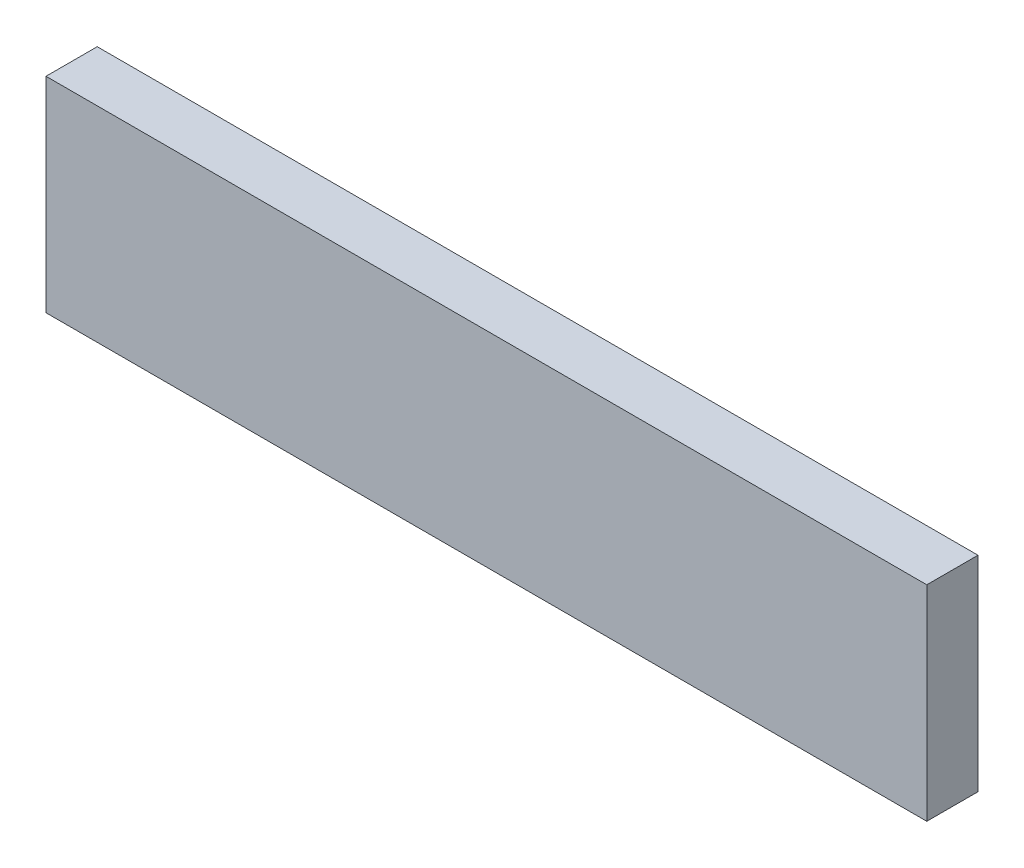
ISO-10303-21;
HEADER;
FILE_DESCRIPTION(('STEP AP214'),'2;1');
FILE_NAME('part.step','',(''),(''),'','','');
FILE_SCHEMA(('AUTOMOTIVE_DESIGN { 1 0 10303 214 1 1 1 1 }'));
ENDSEC;
DATA;
#1=APPLICATION_CONTEXT('core data for automotive mechanical design processes');
#2=APPLICATION_PROTOCOL_DEFINITION('international standard','automotive_design',2000,#1);
#3=PRODUCT_CONTEXT('',#1,'mechanical');
#4=PRODUCT('Part','Part','',(#3));
#5=PRODUCT_RELATED_PRODUCT_CATEGORY('part','',(#4));
#6=PRODUCT_DEFINITION_FORMATION('','',#4);
#7=PRODUCT_DEFINITION_CONTEXT('part definition',#1,'design');
#8=PRODUCT_DEFINITION('design','',#6,#7);
#9=PRODUCT_DEFINITION_SHAPE('','',#8);
#10=(LENGTH_UNIT() NAMED_UNIT(*) SI_UNIT(.MILLI.,.METRE.));
#11=(NAMED_UNIT(*) PLANE_ANGLE_UNIT() SI_UNIT($,.RADIAN.));
#12=(NAMED_UNIT(*) SI_UNIT($,.STERADIAN.) SOLID_ANGLE_UNIT());
#13=UNCERTAINTY_MEASURE_WITH_UNIT(LENGTH_MEASURE(1.E-05),#10,'distance_accuracy_value','');
#14=(GEOMETRIC_REPRESENTATION_CONTEXT(3) GLOBAL_UNCERTAINTY_ASSIGNED_CONTEXT((#13)) GLOBAL_UNIT_ASSIGNED_CONTEXT((#10,
#11,#12)) REPRESENTATION_CONTEXT('',''));
#15=CARTESIAN_POINT('',(0.,0.,0.));
#16=DIRECTION('',(0.,0.,1.));
#17=DIRECTION('',(1.,0.,0.));
#18=AXIS2_PLACEMENT_3D('',#15,#16,#17);
#19=CARTESIAN_POINT('',(-50.6256146951868,20.,5.));
#20=DIRECTION('',(1.,0.,0.));
#21=DIRECTION('',(0.,0.,-1.));
#22=AXIS2_PLACEMENT_3D('',#19,#20,#21);
#23=PLANE('',#22);
#24=DIRECTION('',(0.,-1.,0.));
#25=VECTOR('',#24,1.);
#26=CARTESIAN_POINT('',(-50.6256146951868,20.,0.));
#27=LINE('',#26,#25);
#28=CARTESIAN_POINT('',(-50.6256146951868,20.,0.));
#29=VERTEX_POINT('',#28);
#30=CARTESIAN_POINT('',(-50.6256146951868,0.,0.));
#31=VERTEX_POINT('',#30);
#32=EDGE_CURVE('E96',#29,#31,#27,.T.);
#33=ORIENTED_EDGE('',*,*,#32,.T.);
#34=DIRECTION('',(0.,0.,-1.));
#35=VECTOR('',#34,1.);
#36=CARTESIAN_POINT('',(-50.6256146951868,0.,5.));
#37=LINE('',#36,#35);
#38=CARTESIAN_POINT('',(-50.6256146951868,0.,5.));
#39=VERTEX_POINT('',#38);
#40=EDGE_CURVE('E11',#39,#31,#37,.T.);
#41=ORIENTED_EDGE('',*,*,#40,.F.);
#42=DIRECTION('',(0.,-1.,0.));
#43=VECTOR('',#42,1.);
#44=CARTESIAN_POINT('',(-50.6256146951868,20.,5.));
#45=LINE('',#44,#43);
#46=CARTESIAN_POINT('',(-50.6256146951868,20.,5.));
#47=VERTEX_POINT('',#46);
#48=EDGE_CURVE('E84',#47,#39,#45,.T.);
#49=ORIENTED_EDGE('',*,*,#48,.F.);
#50=DIRECTION('',(0.,0.,-1.));
#51=VECTOR('',#50,1.);
#52=CARTESIAN_POINT('',(-50.6256146951868,20.,5.));
#53=LINE('',#52,#51);
#54=EDGE_CURVE('E92',#47,#29,#53,.T.);
#55=ORIENTED_EDGE('',*,*,#54,.T.);
#56=EDGE_LOOP('',(#33,#41,#49,#55));
#57=FACE_BOUND('',#56,.T.);
#58=ADVANCED_FACE('F33',(#57),#23,.F.);
#59=CARTESIAN_POINT('',(-50.6256146951868,0.,5.));
#60=DIRECTION('',(0.,1.,0.));
#61=DIRECTION('',(0.,0.,1.));
#62=AXIS2_PLACEMENT_3D('',#59,#60,#61);
#63=PLANE('',#62);
#64=DIRECTION('',(1.,0.,0.));
#65=VECTOR('',#64,1.);
#66=CARTESIAN_POINT('',(-50.6256146951868,0.,0.));
#67=LINE('',#66,#65);
#68=CARTESIAN_POINT('',(35.3743853048131,0.,0.));
#69=VERTEX_POINT('',#68);
#70=EDGE_CURVE('E88',#31,#69,#67,.T.);
#71=ORIENTED_EDGE('',*,*,#70,.T.);
#72=DIRECTION('',(0.,0.,-1.));
#73=VECTOR('',#72,1.);
#74=CARTESIAN_POINT('',(35.3743853048131,0.,5.));
#75=LINE('',#74,#73);
#76=CARTESIAN_POINT('',(35.3743853048131,0.,5.));
#77=VERTEX_POINT('',#76);
#78=EDGE_CURVE('E41',#77,#69,#75,.T.);
#79=ORIENTED_EDGE('',*,*,#78,.F.);
#80=DIRECTION('',(1.,0.,0.));
#81=VECTOR('',#80,1.);
#82=CARTESIAN_POINT('',(-50.6256146951868,0.,5.));
#83=LINE('',#82,#81);
#84=EDGE_CURVE('E79',#39,#77,#83,.T.);
#85=ORIENTED_EDGE('',*,*,#84,.F.);
#86=ORIENTED_EDGE('',*,*,#40,.T.);
#87=EDGE_LOOP('',(#71,#79,#85,#86));
#88=FACE_BOUND('',#87,.T.);
#89=ADVANCED_FACE('F87',(#88),#63,.F.);
#90=CARTESIAN_POINT('',(35.3743853048131,20.,5.));
#91=DIRECTION('',(-1.,0.,0.));
#92=DIRECTION('',(0.,0.,1.));
#93=AXIS2_PLACEMENT_3D('',#90,#91,#92);
#94=PLANE('',#93);
#95=DIRECTION('',(0.,1.,0.));
#96=VECTOR('',#95,1.);
#97=CARTESIAN_POINT('',(35.3743853048131,20.,0.));
#98=LINE('',#97,#96);
#99=CARTESIAN_POINT('',(35.3743853048131,20.,0.));
#100=VERTEX_POINT('',#99);
#101=EDGE_CURVE('E66',#69,#100,#98,.T.);
#102=ORIENTED_EDGE('',*,*,#101,.T.);
#103=DIRECTION('',(0.,0.,-1.));
#104=VECTOR('',#103,1.);
#105=CARTESIAN_POINT('',(35.3743853048131,20.,5.));
#106=LINE('',#105,#104);
#107=CARTESIAN_POINT('',(35.3743853048131,20.,5.));
#108=VERTEX_POINT('',#107);
#109=EDGE_CURVE('E89',#108,#100,#106,.T.);
#110=ORIENTED_EDGE('',*,*,#109,.F.);
#111=DIRECTION('',(0.,1.,0.));
#112=VECTOR('',#111,1.);
#113=CARTESIAN_POINT('',(35.3743853048131,20.,5.));
#114=LINE('',#113,#112);
#115=EDGE_CURVE('E82',#77,#108,#114,.T.);
#116=ORIENTED_EDGE('',*,*,#115,.F.);
#117=ORIENTED_EDGE('',*,*,#78,.T.);
#118=EDGE_LOOP('',(#102,#110,#116,#117));
#119=FACE_BOUND('',#118,.T.);
#120=ADVANCED_FACE('F90',(#119),#94,.F.);
#121=CARTESIAN_POINT('',(-50.6256146951868,20.,5.));
#122=DIRECTION('',(0.,-1.,0.));
#123=DIRECTION('',(0.,0.,-1.));
#124=AXIS2_PLACEMENT_3D('',#121,#122,#123);
#125=PLANE('',#124);
#126=DIRECTION('',(-1.,0.,0.));
#127=VECTOR('',#126,1.);
#128=CARTESIAN_POINT('',(-50.6256146951868,20.,0.));
#129=LINE('',#128,#127);
#130=EDGE_CURVE('E72',#100,#29,#129,.T.);
#131=ORIENTED_EDGE('',*,*,#130,.T.);
#132=ORIENTED_EDGE('',*,*,#54,.F.);
#133=DIRECTION('',(-1.,0.,0.));
#134=VECTOR('',#133,1.);
#135=CARTESIAN_POINT('',(-50.6256146951868,20.,5.));
#136=LINE('',#135,#134);
#137=EDGE_CURVE('E49',#108,#47,#136,.T.);
#138=ORIENTED_EDGE('',*,*,#137,.F.);
#139=ORIENTED_EDGE('',*,*,#109,.T.);
#140=EDGE_LOOP('',(#131,#132,#138,#139));
#141=FACE_BOUND('',#140,.T.);
#142=ADVANCED_FACE('F103',(#141),#125,.F.);
#143=CARTESIAN_POINT('',(0.,0.,5.));
#144=DIRECTION('',(0.,0.,1.));
#145=DIRECTION('',(1.,0.,0.));
#146=AXIS2_PLACEMENT_3D('',#143,#144,#145);
#147=PLANE('',#146);
#148=ORIENTED_EDGE('',*,*,#48,.T.);
#149=ORIENTED_EDGE('',*,*,#84,.T.);
#150=ORIENTED_EDGE('',*,*,#115,.T.);
#151=ORIENTED_EDGE('',*,*,#137,.T.);
#152=EDGE_LOOP('',(#148,#149,#150,#151));
#153=FACE_BOUND('',#152,.T.);
#154=ADVANCED_FACE('F80',(#153),#147,.T.);
#155=CARTESIAN_POINT('',(0.,0.,0.));
#156=DIRECTION('',(0.,0.,1.));
#157=DIRECTION('',(1.,0.,0.));
#158=AXIS2_PLACEMENT_3D('',#155,#156,#157);
#159=PLANE('',#158);
#160=ORIENTED_EDGE('',*,*,#32,.F.);
#161=ORIENTED_EDGE('',*,*,#130,.F.);
#162=ORIENTED_EDGE('',*,*,#101,.F.);
#163=ORIENTED_EDGE('',*,*,#70,.F.);
#164=EDGE_LOOP('',(#160,#161,#162,#163));
#165=FACE_BOUND('',#164,.T.);
#166=ADVANCED_FACE('F106',(#165),#159,.F.);
#167=CLOSED_SHELL('',(#58,#89,#120,#142,#154,#166));
#168=MANIFOLD_SOLID_BREP('B2',#167);
#169=ADVANCED_BREP_SHAPE_REPRESENTATION('',(#18,#168),#14);
#170=SHAPE_DEFINITION_REPRESENTATION(#9,#169);
ENDSEC;
END-ISO-10303-21;
